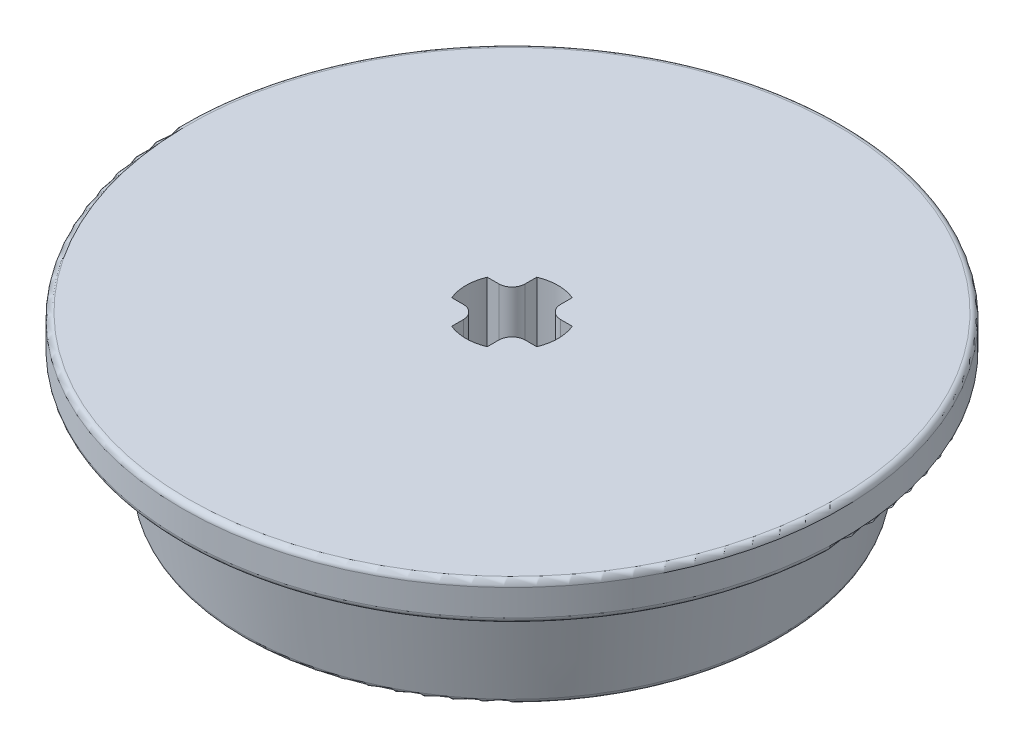
ISO-10303-21;
HEADER;
FILE_DESCRIPTION(('STEP AP214'),'2;1');
FILE_NAME('part.step','',(''),(''),'','','');
FILE_SCHEMA(('AUTOMOTIVE_DESIGN { 1 0 10303 214 1 1 1 1 }'));
ENDSEC;
DATA;
#1=APPLICATION_CONTEXT('core data for automotive mechanical design processes');
#2=APPLICATION_PROTOCOL_DEFINITION('international standard','automotive_design',2000,#1);
#3=PRODUCT_CONTEXT('',#1,'mechanical');
#4=PRODUCT('Part','Part','',(#3));
#5=PRODUCT_RELATED_PRODUCT_CATEGORY('part','',(#4));
#6=PRODUCT_DEFINITION_FORMATION('','',#4);
#7=PRODUCT_DEFINITION_CONTEXT('part definition',#1,'design');
#8=PRODUCT_DEFINITION('design','',#6,#7);
#9=PRODUCT_DEFINITION_SHAPE('','',#8);
#10=(LENGTH_UNIT() NAMED_UNIT(*) SI_UNIT(.MILLI.,.METRE.));
#11=(NAMED_UNIT(*) PLANE_ANGLE_UNIT() SI_UNIT($,.RADIAN.));
#12=(NAMED_UNIT(*) SI_UNIT($,.STERADIAN.) SOLID_ANGLE_UNIT());
#13=UNCERTAINTY_MEASURE_WITH_UNIT(LENGTH_MEASURE(1.E-05),#10,'distance_accuracy_value','');
#14=(GEOMETRIC_REPRESENTATION_CONTEXT(3) GLOBAL_UNCERTAINTY_ASSIGNED_CONTEXT((#13)) GLOBAL_UNIT_ASSIGNED_CONTEXT((#10,
#11,#12)) REPRESENTATION_CONTEXT('',''));
#15=CARTESIAN_POINT('',(0.,0.,0.));
#16=DIRECTION('',(0.,0.,1.));
#17=DIRECTION('',(1.,0.,0.));
#18=AXIS2_PLACEMENT_3D('',#15,#16,#17);
#19=CARTESIAN_POINT('',(0.,0.,0.));
#20=DIRECTION('',(0.,1.,0.));
#21=DIRECTION('',(0.,0.,1.));
#22=AXIS2_PLACEMENT_3D('',#19,#20,#21);
#23=PLANE('',#22);
#24=CARTESIAN_POINT('',(0.,0.,0.));
#25=DIRECTION('',(0.,1.,0.));
#26=DIRECTION('',(0.,0.,1.));
#27=AXIS2_PLACEMENT_3D('',#24,#25,#26);
#28=CIRCLE('',#27,17.1604709958205);
#29=CARTESIAN_POINT('',(0.,0.,17.1604709958205));
#30=VERTEX_POINT('',#29);
#31=EDGE_CURVE('E292',#30,#30,#28,.T.);
#32=ORIENTED_EDGE('',*,*,#31,.T.);
#33=EDGE_LOOP('',(#32));
#34=FACE_BOUND('',#33,.T.);
#35=DIRECTION('',(0.,0.,1.));
#36=VECTOR('',#35,1.);
#37=CARTESIAN_POINT('',(-0.940000000000001,0.,0.940000000000009));
#38=LINE('',#37,#36);
#39=CARTESIAN_POINT('',(-0.940000000000001,0.,1.64000000000001));
#40=VERTEX_POINT('',#39);
#41=CARTESIAN_POINT('',(-0.94,0.,2.25166604983954));
#42=VERTEX_POINT('',#41);
#43=EDGE_CURVE('E209',#40,#42,#38,.T.);
#44=ORIENTED_EDGE('',*,*,#43,.F.);
#45=CARTESIAN_POINT('',(-1.64,0.,1.64000000000001));
#46=DIRECTION('',(0.,1.,0.));
#47=DIRECTION('',(0.,0.,1.));
#48=AXIS2_PLACEMENT_3D('',#45,#46,#47);
#49=CIRCLE('',#48,0.7);
#50=CARTESIAN_POINT('',(-1.64,0.,0.940000000000009));
#51=VERTEX_POINT('',#50);
#52=EDGE_CURVE('E253',#40,#51,#49,.T.);
#53=ORIENTED_EDGE('',*,*,#52,.T.);
#54=DIRECTION('',(1.,0.,0.));
#55=VECTOR('',#54,1.);
#56=CARTESIAN_POINT('',(-2.25166604983954,0.,0.940000000000009));
#57=LINE('',#56,#55);
#58=CARTESIAN_POINT('',(-2.25166604983954,0.,0.940000000000008));
#59=VERTEX_POINT('',#58);
#60=EDGE_CURVE('E207',#59,#51,#57,.T.);
#61=ORIENTED_EDGE('',*,*,#60,.F.);
#62=CARTESIAN_POINT('',(0.,0.,0.));
#63=DIRECTION('',(0.,1.,0.));
#64=DIRECTION('',(0.,0.,1.));
#65=AXIS2_PLACEMENT_3D('',#62,#63,#64);
#66=CIRCLE('',#65,2.44);
#67=CARTESIAN_POINT('',(-2.25166604983954,0.,-0.940000000000009));
#68=VERTEX_POINT('',#67);
#69=EDGE_CURVE('E159',#68,#59,#66,.T.);
#70=ORIENTED_EDGE('',*,*,#69,.F.);
#71=DIRECTION('',(-1.,0.,0.));
#72=VECTOR('',#71,1.);
#73=CARTESIAN_POINT('',(-0.94,0.,-0.940000000000009));
#74=LINE('',#73,#72);
#75=CARTESIAN_POINT('',(-1.64,0.,-0.940000000000009));
#76=VERTEX_POINT('',#75);
#77=EDGE_CURVE('E204',#76,#68,#74,.T.);
#78=ORIENTED_EDGE('',*,*,#77,.F.);
#79=CARTESIAN_POINT('',(-1.64,0.,-1.64000000000001));
#80=DIRECTION('',(0.,1.,0.));
#81=DIRECTION('',(0.,0.,1.));
#82=AXIS2_PLACEMENT_3D('',#79,#80,#81);
#83=CIRCLE('',#82,0.7);
#84=CARTESIAN_POINT('',(-0.94,0.,-1.64000000000001));
#85=VERTEX_POINT('',#84);
#86=EDGE_CURVE('E247',#76,#85,#83,.T.);
#87=ORIENTED_EDGE('',*,*,#86,.T.);
#88=DIRECTION('',(0.,0.,1.));
#89=VECTOR('',#88,1.);
#90=CARTESIAN_POINT('',(-0.94,0.,-2.25166604983954));
#91=LINE('',#90,#89);
#92=CARTESIAN_POINT('',(-0.940000000000001,0.,-2.25166604983954));
#93=VERTEX_POINT('',#92);
#94=EDGE_CURVE('E201',#93,#85,#91,.T.);
#95=ORIENTED_EDGE('',*,*,#94,.F.);
#96=CARTESIAN_POINT('',(0.,0.,0.));
#97=DIRECTION('',(0.,1.,0.));
#98=DIRECTION('',(0.,0.,-1.));
#99=AXIS2_PLACEMENT_3D('',#96,#97,#98);
#100=CIRCLE('',#99,2.44);
#101=CARTESIAN_POINT('',(0.94,0.,-2.25166604983954));
#102=VERTEX_POINT('',#101);
#103=EDGE_CURVE('E226',#102,#93,#100,.T.);
#104=ORIENTED_EDGE('',*,*,#103,.F.);
#105=DIRECTION('',(0.,0.,-1.));
#106=VECTOR('',#105,1.);
#107=CARTESIAN_POINT('',(0.94,0.,-2.25166604983954));
#108=LINE('',#107,#106);
#109=CARTESIAN_POINT('',(0.94,0.,-1.64));
#110=VERTEX_POINT('',#109);
#111=EDGE_CURVE('E224',#110,#102,#108,.T.);
#112=ORIENTED_EDGE('',*,*,#111,.F.);
#113=CARTESIAN_POINT('',(1.64,0.,-1.64));
#114=DIRECTION('',(0.,1.,0.));
#115=DIRECTION('',(0.,0.,1.));
#116=AXIS2_PLACEMENT_3D('',#113,#114,#115);
#117=CIRCLE('',#116,0.7);
#118=CARTESIAN_POINT('',(1.64,0.,-0.940000000000003));
#119=VERTEX_POINT('',#118);
#120=EDGE_CURVE('E249',#110,#119,#117,.T.);
#121=ORIENTED_EDGE('',*,*,#120,.T.);
#122=DIRECTION('',(-1.,0.,0.));
#123=VECTOR('',#122,1.);
#124=CARTESIAN_POINT('',(0.94,0.,-0.940000000000003));
#125=LINE('',#124,#123);
#126=CARTESIAN_POINT('',(2.25166604983954,0.,-0.940000000000003));
#127=VERTEX_POINT('',#126);
#128=EDGE_CURVE('E222',#127,#119,#125,.T.);
#129=ORIENTED_EDGE('',*,*,#128,.F.);
#130=CARTESIAN_POINT('',(0.,0.,0.));
#131=DIRECTION('',(0.,1.,0.));
#132=DIRECTION('',(0.,0.,-1.));
#133=AXIS2_PLACEMENT_3D('',#130,#131,#132);
#134=CIRCLE('',#133,2.44);
#135=CARTESIAN_POINT('',(2.25166604983954,0.,0.940000000000003));
#136=VERTEX_POINT('',#135);
#137=EDGE_CURVE('E219',#136,#127,#134,.T.);
#138=ORIENTED_EDGE('',*,*,#137,.F.);
#139=DIRECTION('',(1.,0.,0.));
#140=VECTOR('',#139,1.);
#141=CARTESIAN_POINT('',(0.940000000000001,0.,0.940000000000003));
#142=LINE('',#141,#140);
#143=CARTESIAN_POINT('',(1.64,0.,0.940000000000003));
#144=VERTEX_POINT('',#143);
#145=EDGE_CURVE('E217',#144,#136,#142,.T.);
#146=ORIENTED_EDGE('',*,*,#145,.F.);
#147=CARTESIAN_POINT('',(1.64,0.,1.64));
#148=DIRECTION('',(0.,1.,0.));
#149=DIRECTION('',(0.,0.,1.));
#150=AXIS2_PLACEMENT_3D('',#147,#148,#149);
#151=CIRCLE('',#150,0.7);
#152=CARTESIAN_POINT('',(0.940000000000001,0.,1.64));
#153=VERTEX_POINT('',#152);
#154=EDGE_CURVE('E251',#144,#153,#151,.T.);
#155=ORIENTED_EDGE('',*,*,#154,.T.);
#156=DIRECTION('',(0.,0.,-1.));
#157=VECTOR('',#156,1.);
#158=CARTESIAN_POINT('',(0.940000000000001,0.,2.25166604983954));
#159=LINE('',#158,#157);
#160=CARTESIAN_POINT('',(0.94,0.,2.25166604983954));
#161=VERTEX_POINT('',#160);
#162=EDGE_CURVE('E214',#161,#153,#159,.T.);
#163=ORIENTED_EDGE('',*,*,#162,.F.);
#164=CARTESIAN_POINT('',(0.,0.,0.));
#165=DIRECTION('',(0.,1.,0.));
#166=DIRECTION('',(0.,0.,1.));
#167=AXIS2_PLACEMENT_3D('',#164,#165,#166);
#168=CIRCLE('',#167,2.44);
#169=EDGE_CURVE('E211',#42,#161,#168,.T.);
#170=ORIENTED_EDGE('',*,*,#169,.F.);
#171=EDGE_LOOP('',(#44,#53,#61,#70,#78,#87,#95,#104,#112,#121,#129,#138,#146,#155,#163,#170));
#172=FACE_BOUND('',#171,.T.);
#173=ADVANCED_FACE('F36',(#34,#172),#23,.T.);
#174=CARTESIAN_POINT('',(0.,0.,0.));
#175=DIRECTION('',(0.,-1.,0.));
#176=DIRECTION('',(0.,0.,-1.));
#177=AXIS2_PLACEMENT_3D('',#174,#175,#176);
#178=CYLINDRICAL_SURFACE('',#177,17.4604709958205);
#179=CARTESIAN_POINT('',(0.,-0.3,0.));
#180=DIRECTION('',(0.,1.,0.));
#181=DIRECTION('',(0.,0.,1.));
#182=AXIS2_PLACEMENT_3D('',#179,#180,#181);
#183=CIRCLE('',#182,17.4604709958205);
#184=CARTESIAN_POINT('',(0.,-0.3,17.4604709958205));
#185=VERTEX_POINT('',#184);
#186=EDGE_CURVE('E289',#185,#185,#183,.F.);
#187=ORIENTED_EDGE('',*,*,#186,.T.);
#188=EDGE_LOOP('',(#187));
#189=FACE_BOUND('',#188,.T.);
#190=CARTESIAN_POINT('',(0.,-1.7,0.));
#191=DIRECTION('',(0.,-1.,0.));
#192=DIRECTION('',(0.,0.,-1.));
#193=AXIS2_PLACEMENT_3D('',#190,#191,#192);
#194=CIRCLE('',#193,17.4604709958205);
#195=CARTESIAN_POINT('',(0.,-1.7,-17.4604709958205));
#196=VERTEX_POINT('',#195);
#197=EDGE_CURVE('E286',#196,#196,#194,.F.);
#198=ORIENTED_EDGE('',*,*,#197,.T.);
#199=EDGE_LOOP('',(#198));
#200=FACE_BOUND('',#199,.T.);
#201=ADVANCED_FACE('F309',(#189,#200),#178,.T.);
#202=CARTESIAN_POINT('',(17.4604709958205,-2.,0.));
#203=DIRECTION('',(0.,-1.,0.));
#204=DIRECTION('',(0.,0.,-1.));
#205=AXIS2_PLACEMENT_3D('',#202,#203,#204);
#206=PLANE('',#205);
#207=CARTESIAN_POINT('',(0.,-2.,0.));
#208=DIRECTION('',(0.,-1.,0.));
#209=DIRECTION('',(0.,0.,-1.));
#210=AXIS2_PLACEMENT_3D('',#207,#208,#209);
#211=CIRCLE('',#210,15.2607860213451);
#212=CARTESIAN_POINT('',(0.,-2.,-15.2607860213451));
#213=VERTEX_POINT('',#212);
#214=EDGE_CURVE('E11',#213,#213,#211,.F.);
#215=ORIENTED_EDGE('',*,*,#214,.T.);
#216=EDGE_LOOP('',(#215));
#217=FACE_BOUND('',#216,.T.);
#218=CARTESIAN_POINT('',(0.,-2.,0.));
#219=DIRECTION('',(0.,-1.,0.));
#220=DIRECTION('',(0.,0.,-1.));
#221=AXIS2_PLACEMENT_3D('',#218,#219,#220);
#222=CIRCLE('',#221,17.1604709958205);
#223=CARTESIAN_POINT('',(0.,-2.,-17.1604709958205));
#224=VERTEX_POINT('',#223);
#225=EDGE_CURVE('E44',#224,#224,#222,.T.);
#226=ORIENTED_EDGE('',*,*,#225,.T.);
#227=EDGE_LOOP('',(#226));
#228=FACE_BOUND('',#227,.T.);
#229=ADVANCED_FACE('F297',(#217,#228),#206,.T.);
#230=CARTESIAN_POINT('',(0.,-8.,0.));
#231=DIRECTION('',(0.,1.,0.));
#232=DIRECTION('',(0.,0.,1.));
#233=AXIS2_PLACEMENT_3D('',#230,#231,#232);
#234=CONICAL_SURFACE('',#233,14.1567549917908,0.139626340158703);
#235=CARTESIAN_POINT('',(0.,-7.74175193028776,0.));
#236=DIRECTION('',(0.,-1.,0.));
#237=DIRECTION('',(0.,0.,-1.));
#238=AXIS2_PLACEMENT_3D('',#235,#236,#237);
#239=CIRCLE('',#238,14.1930493910682);
#240=CARTESIAN_POINT('',(0.,-7.74175193028776,-14.1930493910682));
#241=VERTEX_POINT('',#240);
#242=EDGE_CURVE('E283',#241,#241,#239,.F.);
#243=ORIENTED_EDGE('',*,*,#242,.T.);
#244=EDGE_LOOP('',(#243));
#245=FACE_BOUND('',#244,.T.);
#246=CARTESIAN_POINT('',(0.,-2.25824806971223,0.));
#247=DIRECTION('',(0.,1.,0.));
#248=DIRECTION('',(0.,0.,1.));
#249=AXIS2_PLACEMENT_3D('',#246,#247,#248);
#250=CIRCLE('',#249,14.9637056007226);
#251=CARTESIAN_POINT('',(0.,-2.25824806971223,14.9637056007226));
#252=VERTEX_POINT('',#251);
#253=EDGE_CURVE('E280',#252,#252,#250,.F.);
#254=ORIENTED_EDGE('',*,*,#253,.T.);
#255=EDGE_LOOP('',(#254));
#256=FACE_BOUND('',#255,.T.);
#257=ADVANCED_FACE('F519',(#245,#256),#234,.T.);
#258=CARTESIAN_POINT('',(14.1567549917908,-8.,0.));
#259=DIRECTION('',(0.,-1.,0.));
#260=DIRECTION('',(0.,0.,-1.));
#261=AXIS2_PLACEMENT_3D('',#258,#259,#260);
#262=PLANE('',#261);
#263=CARTESIAN_POINT('',(0.,-8.,0.));
#264=DIRECTION('',(0.,-1.,0.));
#265=DIRECTION('',(0.,0.,-1.));
#266=AXIS2_PLACEMENT_3D('',#263,#264,#265);
#267=CIRCLE('',#266,13.8959689704457);
#268=CARTESIAN_POINT('',(0.,-8.,-13.8959689704457));
#269=VERTEX_POINT('',#268);
#270=EDGE_CURVE('E277',#269,#269,#267,.T.);
#271=ORIENTED_EDGE('',*,*,#270,.T.);
#272=EDGE_LOOP('',(#271));
#273=FACE_BOUND('',#272,.T.);
#274=DIRECTION('',(1.,0.,0.));
#275=VECTOR('',#274,1.);
#276=CARTESIAN_POINT('',(-2.25166604983954,-8.,0.940000000000009));
#277=LINE('',#276,#275);
#278=CARTESIAN_POINT('',(-2.25166604983954,-8.,0.940000000000008));
#279=VERTEX_POINT('',#278);
#280=CARTESIAN_POINT('',(-1.64,-8.,0.940000000000009));
#281=VERTEX_POINT('',#280);
#282=EDGE_CURVE('E167',#279,#281,#277,.T.);
#283=ORIENTED_EDGE('',*,*,#282,.T.);
#284=CARTESIAN_POINT('',(-1.64,-8.,1.64000000000001));
#285=DIRECTION('',(0.,-1.,0.));
#286=DIRECTION('',(0.,0.,-1.));
#287=AXIS2_PLACEMENT_3D('',#284,#285,#286);
#288=CIRCLE('',#287,0.7);
#289=CARTESIAN_POINT('',(-0.940000000000001,-8.,1.64000000000001));
#290=VERTEX_POINT('',#289);
#291=EDGE_CURVE('E261',#281,#290,#288,.T.);
#292=ORIENTED_EDGE('',*,*,#291,.T.);
#293=DIRECTION('',(0.,0.,1.));
#294=VECTOR('',#293,1.);
#295=CARTESIAN_POINT('',(-0.940000000000001,-8.,0.940000000000009));
#296=LINE('',#295,#294);
#297=CARTESIAN_POINT('',(-0.94,-8.,2.25166604983954));
#298=VERTEX_POINT('',#297);
#299=EDGE_CURVE('E172',#290,#298,#296,.T.);
#300=ORIENTED_EDGE('',*,*,#299,.T.);
#301=CARTESIAN_POINT('',(0.,-8.,0.));
#302=DIRECTION('',(0.,1.,0.));
#303=DIRECTION('',(0.,0.,1.));
#304=AXIS2_PLACEMENT_3D('',#301,#302,#303);
#305=CIRCLE('',#304,2.44);
#306=CARTESIAN_POINT('',(0.94,-8.,2.25166604983954));
#307=VERTEX_POINT('',#306);
#308=EDGE_CURVE('E183',#298,#307,#305,.T.);
#309=ORIENTED_EDGE('',*,*,#308,.T.);
#310=DIRECTION('',(0.,0.,-1.));
#311=VECTOR('',#310,1.);
#312=CARTESIAN_POINT('',(0.940000000000001,-8.,2.25166604983954));
#313=LINE('',#312,#311);
#314=CARTESIAN_POINT('',(0.940000000000001,-8.,1.64));
#315=VERTEX_POINT('',#314);
#316=EDGE_CURVE('E186',#307,#315,#313,.T.);
#317=ORIENTED_EDGE('',*,*,#316,.T.);
#318=CARTESIAN_POINT('',(1.64,-8.,1.64));
#319=DIRECTION('',(0.,-1.,0.));
#320=DIRECTION('',(0.,0.,-1.));
#321=AXIS2_PLACEMENT_3D('',#318,#319,#320);
#322=CIRCLE('',#321,0.7);
#323=CARTESIAN_POINT('',(1.64,-8.,0.940000000000003));
#324=VERTEX_POINT('',#323);
#325=EDGE_CURVE('E259',#315,#324,#322,.T.);
#326=ORIENTED_EDGE('',*,*,#325,.T.);
#327=DIRECTION('',(1.,0.,0.));
#328=VECTOR('',#327,1.);
#329=CARTESIAN_POINT('',(0.940000000000001,-8.,0.940000000000003));
#330=LINE('',#329,#328);
#331=CARTESIAN_POINT('',(2.25166604983954,-8.,0.940000000000003));
#332=VERTEX_POINT('',#331);
#333=EDGE_CURVE('E189',#324,#332,#330,.T.);
#334=ORIENTED_EDGE('',*,*,#333,.T.);
#335=CARTESIAN_POINT('',(0.,-8.,0.));
#336=DIRECTION('',(0.,1.,0.));
#337=DIRECTION('',(0.,0.,-1.));
#338=AXIS2_PLACEMENT_3D('',#335,#336,#337);
#339=CIRCLE('',#338,2.44);
#340=CARTESIAN_POINT('',(2.25166604983954,-8.,-0.940000000000003));
#341=VERTEX_POINT('',#340);
#342=EDGE_CURVE('E191',#332,#341,#339,.T.);
#343=ORIENTED_EDGE('',*,*,#342,.T.);
#344=DIRECTION('',(-1.,0.,0.));
#345=VECTOR('',#344,1.);
#346=CARTESIAN_POINT('',(0.94,-8.,-0.940000000000003));
#347=LINE('',#346,#345);
#348=CARTESIAN_POINT('',(1.64,-8.,-0.940000000000003));
#349=VERTEX_POINT('',#348);
#350=EDGE_CURVE('E194',#341,#349,#347,.T.);
#351=ORIENTED_EDGE('',*,*,#350,.T.);
#352=CARTESIAN_POINT('',(1.64,-8.,-1.64));
#353=DIRECTION('',(0.,-1.,0.));
#354=DIRECTION('',(0.,0.,-1.));
#355=AXIS2_PLACEMENT_3D('',#352,#353,#354);
#356=CIRCLE('',#355,0.7);
#357=CARTESIAN_POINT('',(0.94,-8.,-1.64));
#358=VERTEX_POINT('',#357);
#359=EDGE_CURVE('E51',#349,#358,#356,.T.);
#360=ORIENTED_EDGE('',*,*,#359,.T.);
#361=DIRECTION('',(0.,0.,-1.));
#362=VECTOR('',#361,1.);
#363=CARTESIAN_POINT('',(0.94,-8.,-2.25166604983954));
#364=LINE('',#363,#362);
#365=CARTESIAN_POINT('',(0.94,-8.,-2.25166604983954));
#366=VERTEX_POINT('',#365);
#367=EDGE_CURVE('E196',#358,#366,#364,.T.);
#368=ORIENTED_EDGE('',*,*,#367,.T.);
#369=CARTESIAN_POINT('',(0.,-8.,0.));
#370=DIRECTION('',(0.,1.,0.));
#371=DIRECTION('',(0.,0.,-1.));
#372=AXIS2_PLACEMENT_3D('',#369,#370,#371);
#373=CIRCLE('',#372,2.44);
#374=CARTESIAN_POINT('',(-0.940000000000001,-8.,-2.25166604983954));
#375=VERTEX_POINT('',#374);
#376=EDGE_CURVE('E198',#366,#375,#373,.T.);
#377=ORIENTED_EDGE('',*,*,#376,.T.);
#378=DIRECTION('',(0.,0.,1.));
#379=VECTOR('',#378,1.);
#380=CARTESIAN_POINT('',(-0.94,-8.,-2.25166604983954));
#381=LINE('',#380,#379);
#382=CARTESIAN_POINT('',(-0.94,-8.,-1.64000000000001));
#383=VERTEX_POINT('',#382);
#384=EDGE_CURVE('E178',#375,#383,#381,.T.);
#385=ORIENTED_EDGE('',*,*,#384,.T.);
#386=CARTESIAN_POINT('',(-1.64,-8.,-1.64000000000001));
#387=DIRECTION('',(0.,-1.,0.));
#388=DIRECTION('',(0.,0.,-1.));
#389=AXIS2_PLACEMENT_3D('',#386,#387,#388);
#390=CIRCLE('',#389,0.7);
#391=CARTESIAN_POINT('',(-1.64,-8.,-0.940000000000009));
#392=VERTEX_POINT('',#391);
#393=EDGE_CURVE('E256',#383,#392,#390,.T.);
#394=ORIENTED_EDGE('',*,*,#393,.T.);
#395=DIRECTION('',(-1.,0.,0.));
#396=VECTOR('',#395,1.);
#397=CARTESIAN_POINT('',(-0.94,-8.,-0.940000000000009));
#398=LINE('',#397,#396);
#399=CARTESIAN_POINT('',(-2.25166604983954,-8.,-0.940000000000009));
#400=VERTEX_POINT('',#399);
#401=EDGE_CURVE('E176',#392,#400,#398,.T.);
#402=ORIENTED_EDGE('',*,*,#401,.T.);
#403=CARTESIAN_POINT('',(0.,-8.,0.));
#404=DIRECTION('',(0.,1.,0.));
#405=DIRECTION('',(0.,0.,1.));
#406=AXIS2_PLACEMENT_3D('',#403,#404,#405);
#407=CIRCLE('',#406,2.44);
#408=EDGE_CURVE('E156',#400,#279,#407,.T.);
#409=ORIENTED_EDGE('',*,*,#408,.T.);
#410=EDGE_LOOP('',(#283,#292,#300,#309,#317,#326,#334,#343,#351,#360,#368,#377,#385,#394,#402,#409));
#411=FACE_BOUND('',#410,.T.);
#412=ADVANCED_FACE('F174',(#273,#411),#262,.T.);
#413=CARTESIAN_POINT('',(-0.94,-8.,-2.25166604983954));
#414=DIRECTION('',(-1.,0.,0.));
#415=DIRECTION('',(0.,0.,1.));
#416=AXIS2_PLACEMENT_3D('',#413,#414,#415);
#417=PLANE('',#416);
#418=ORIENTED_EDGE('',*,*,#94,.T.);
#419=DIRECTION('',(0.,1.,0.));
#420=VECTOR('',#419,1.);
#421=CARTESIAN_POINT('',(-0.94,-8.,-1.64000000000001));
#422=LINE('',#421,#420);
#423=EDGE_CURVE('E275',#85,#383,#422,.F.);
#424=ORIENTED_EDGE('',*,*,#423,.T.);
#425=ORIENTED_EDGE('',*,*,#384,.F.);
#426=DIRECTION('',(0.,1.,0.));
#427=VECTOR('',#426,1.);
#428=CARTESIAN_POINT('',(-0.940000000000001,-8.,-2.25166604983954));
#429=LINE('',#428,#427);
#430=EDGE_CURVE('E229',#375,#93,#429,.T.);
#431=ORIENTED_EDGE('',*,*,#430,.T.);
#432=EDGE_LOOP('',(#418,#424,#425,#431));
#433=FACE_BOUND('',#432,.T.);
#434=ADVANCED_FACE('F500',(#433),#417,.F.);
#435=CARTESIAN_POINT('',(0.,-8.,0.));
#436=DIRECTION('',(0.,1.,0.));
#437=DIRECTION('',(0.,0.,1.));
#438=AXIS2_PLACEMENT_3D('',#435,#436,#437);
#439=CYLINDRICAL_SURFACE('',#438,2.44);
#440=ORIENTED_EDGE('',*,*,#103,.T.);
#441=ORIENTED_EDGE('',*,*,#430,.F.);
#442=ORIENTED_EDGE('',*,*,#376,.F.);
#443=DIRECTION('',(0.,1.,0.));
#444=VECTOR('',#443,1.);
#445=CARTESIAN_POINT('',(0.94,-8.,-2.25166604983954));
#446=LINE('',#445,#444);
#447=EDGE_CURVE('E232',#366,#102,#446,.T.);
#448=ORIENTED_EDGE('',*,*,#447,.T.);
#449=EDGE_LOOP('',(#440,#441,#442,#448));
#450=FACE_BOUND('',#449,.T.);
#451=ADVANCED_FACE('F490',(#450),#439,.F.);
#452=CARTESIAN_POINT('',(0.94,-8.,-2.25166604983954));
#453=DIRECTION('',(1.,0.,0.));
#454=DIRECTION('',(0.,0.,-1.));
#455=AXIS2_PLACEMENT_3D('',#452,#453,#454);
#456=PLANE('',#455);
#457=ORIENTED_EDGE('',*,*,#367,.F.);
#458=DIRECTION('',(0.,1.,0.));
#459=VECTOR('',#458,1.);
#460=CARTESIAN_POINT('',(0.94,-8.,-1.64));
#461=LINE('',#460,#459);
#462=EDGE_CURVE('E268',#358,#110,#461,.T.);
#463=ORIENTED_EDGE('',*,*,#462,.T.);
#464=ORIENTED_EDGE('',*,*,#111,.T.);
#465=ORIENTED_EDGE('',*,*,#447,.F.);
#466=EDGE_LOOP('',(#457,#463,#464,#465));
#467=FACE_BOUND('',#466,.T.);
#468=ADVANCED_FACE('F481',(#467),#456,.F.);
#469=CARTESIAN_POINT('',(0.94,-8.,-0.940000000000003));
#470=DIRECTION('',(0.,0.,-1.));
#471=DIRECTION('',(-1.,0.,0.));
#472=AXIS2_PLACEMENT_3D('',#469,#470,#471);
#473=PLANE('',#472);
#474=ORIENTED_EDGE('',*,*,#128,.T.);
#475=DIRECTION('',(0.,1.,0.));
#476=VECTOR('',#475,1.);
#477=CARTESIAN_POINT('',(1.64,-8.,-0.940000000000003));
#478=LINE('',#477,#476);
#479=EDGE_CURVE('E59',#119,#349,#478,.F.);
#480=ORIENTED_EDGE('',*,*,#479,.T.);
#481=ORIENTED_EDGE('',*,*,#350,.F.);
#482=DIRECTION('',(0.,1.,0.));
#483=VECTOR('',#482,1.);
#484=CARTESIAN_POINT('',(2.25166604983954,-8.,-0.940000000000003));
#485=LINE('',#484,#483);
#486=EDGE_CURVE('E235',#341,#127,#485,.T.);
#487=ORIENTED_EDGE('',*,*,#486,.T.);
#488=EDGE_LOOP('',(#474,#480,#481,#487));
#489=FACE_BOUND('',#488,.T.);
#490=ADVANCED_FACE('F471',(#489),#473,.F.);
#491=CARTESIAN_POINT('',(0.,-8.,0.));
#492=DIRECTION('',(0.,1.,0.));
#493=DIRECTION('',(0.,0.,1.));
#494=AXIS2_PLACEMENT_3D('',#491,#492,#493);
#495=CYLINDRICAL_SURFACE('',#494,2.44);
#496=ORIENTED_EDGE('',*,*,#137,.T.);
#497=ORIENTED_EDGE('',*,*,#486,.F.);
#498=ORIENTED_EDGE('',*,*,#342,.F.);
#499=DIRECTION('',(0.,1.,0.));
#500=VECTOR('',#499,1.);
#501=CARTESIAN_POINT('',(2.25166604983954,-8.,0.940000000000003));
#502=LINE('',#501,#500);
#503=EDGE_CURVE('E237',#332,#136,#502,.T.);
#504=ORIENTED_EDGE('',*,*,#503,.T.);
#505=EDGE_LOOP('',(#496,#497,#498,#504));
#506=FACE_BOUND('',#505,.T.);
#507=ADVANCED_FACE('F461',(#506),#495,.F.);
#508=CARTESIAN_POINT('',(0.940000000000001,-8.,0.940000000000003));
#509=DIRECTION('',(0.,0.,1.));
#510=DIRECTION('',(1.,0.,0.));
#511=AXIS2_PLACEMENT_3D('',#508,#509,#510);
#512=PLANE('',#511);
#513=ORIENTED_EDGE('',*,*,#333,.F.);
#514=DIRECTION('',(0.,1.,0.));
#515=VECTOR('',#514,1.);
#516=CARTESIAN_POINT('',(1.64,-8.,0.940000000000003));
#517=LINE('',#516,#515);
#518=EDGE_CURVE('E263',#324,#144,#517,.T.);
#519=ORIENTED_EDGE('',*,*,#518,.T.);
#520=ORIENTED_EDGE('',*,*,#145,.T.);
#521=ORIENTED_EDGE('',*,*,#503,.F.);
#522=EDGE_LOOP('',(#513,#519,#520,#521));
#523=FACE_BOUND('',#522,.T.);
#524=ADVANCED_FACE('F451',(#523),#512,.F.);
#525=CARTESIAN_POINT('',(0.940000000000001,-8.,2.25166604983954));
#526=DIRECTION('',(1.,0.,0.));
#527=DIRECTION('',(0.,0.,-1.));
#528=AXIS2_PLACEMENT_3D('',#525,#526,#527);
#529=PLANE('',#528);
#530=ORIENTED_EDGE('',*,*,#162,.T.);
#531=DIRECTION('',(0.,1.,0.));
#532=VECTOR('',#531,1.);
#533=CARTESIAN_POINT('',(0.940000000000001,-8.,1.64));
#534=LINE('',#533,#532);
#535=EDGE_CURVE('E266',#153,#315,#534,.F.);
#536=ORIENTED_EDGE('',*,*,#535,.T.);
#537=ORIENTED_EDGE('',*,*,#316,.F.);
#538=DIRECTION('',(0.,1.,0.));
#539=VECTOR('',#538,1.);
#540=CARTESIAN_POINT('',(0.94,-8.,2.25166604983954));
#541=LINE('',#540,#539);
#542=EDGE_CURVE('E240',#307,#161,#541,.T.);
#543=ORIENTED_EDGE('',*,*,#542,.T.);
#544=EDGE_LOOP('',(#530,#536,#537,#543));
#545=FACE_BOUND('',#544,.T.);
#546=ADVANCED_FACE('F441',(#545),#529,.F.);
#547=CARTESIAN_POINT('',(0.,-8.,0.));
#548=DIRECTION('',(0.,1.,0.));
#549=DIRECTION('',(0.,0.,1.));
#550=AXIS2_PLACEMENT_3D('',#547,#548,#549);
#551=CYLINDRICAL_SURFACE('',#550,2.44);
#552=ORIENTED_EDGE('',*,*,#169,.T.);
#553=ORIENTED_EDGE('',*,*,#542,.F.);
#554=ORIENTED_EDGE('',*,*,#308,.F.);
#555=DIRECTION('',(0.,1.,0.));
#556=VECTOR('',#555,1.);
#557=CARTESIAN_POINT('',(-0.94,-8.,2.25166604983954));
#558=LINE('',#557,#556);
#559=EDGE_CURVE('E163',#298,#42,#558,.T.);
#560=ORIENTED_EDGE('',*,*,#559,.T.);
#561=EDGE_LOOP('',(#552,#553,#554,#560));
#562=FACE_BOUND('',#561,.T.);
#563=ADVANCED_FACE('F431',(#562),#551,.F.);
#564=CARTESIAN_POINT('',(-0.940000000000001,-8.,0.940000000000009));
#565=DIRECTION('',(-1.,0.,0.));
#566=DIRECTION('',(0.,0.,1.));
#567=AXIS2_PLACEMENT_3D('',#564,#565,#566);
#568=PLANE('',#567);
#569=ORIENTED_EDGE('',*,*,#299,.F.);
#570=DIRECTION('',(0.,1.,0.));
#571=VECTOR('',#570,1.);
#572=CARTESIAN_POINT('',(-0.940000000000001,-8.,1.64000000000001));
#573=LINE('',#572,#571);
#574=EDGE_CURVE('E231',#290,#40,#573,.T.);
#575=ORIENTED_EDGE('',*,*,#574,.T.);
#576=ORIENTED_EDGE('',*,*,#43,.T.);
#577=ORIENTED_EDGE('',*,*,#559,.F.);
#578=EDGE_LOOP('',(#569,#575,#576,#577));
#579=FACE_BOUND('',#578,.T.);
#580=ADVANCED_FACE('F422',(#579),#568,.F.);
#581=CARTESIAN_POINT('',(-2.25166604983954,-8.,0.940000000000009));
#582=DIRECTION('',(0.,0.,1.));
#583=DIRECTION('',(1.,0.,0.));
#584=AXIS2_PLACEMENT_3D('',#581,#582,#583);
#585=PLANE('',#584);
#586=ORIENTED_EDGE('',*,*,#60,.T.);
#587=DIRECTION('',(0.,1.,0.));
#588=VECTOR('',#587,1.);
#589=CARTESIAN_POINT('',(-1.64,-8.,0.940000000000009));
#590=LINE('',#589,#588);
#591=EDGE_CURVE('E170',#51,#281,#590,.F.);
#592=ORIENTED_EDGE('',*,*,#591,.T.);
#593=ORIENTED_EDGE('',*,*,#282,.F.);
#594=DIRECTION('',(0.,1.,0.));
#595=VECTOR('',#594,1.);
#596=CARTESIAN_POINT('',(-2.25166604983954,-8.,0.940000000000008));
#597=LINE('',#596,#595);
#598=EDGE_CURVE('E151',#279,#59,#597,.T.);
#599=ORIENTED_EDGE('',*,*,#598,.T.);
#600=EDGE_LOOP('',(#586,#592,#593,#599));
#601=FACE_BOUND('',#600,.T.);
#602=ADVANCED_FACE('F168',(#601),#585,.F.);
#603=CARTESIAN_POINT('',(0.,-8.,0.));
#604=DIRECTION('',(0.,1.,0.));
#605=DIRECTION('',(0.,0.,1.));
#606=AXIS2_PLACEMENT_3D('',#603,#604,#605);
#607=CYLINDRICAL_SURFACE('',#606,2.44);
#608=ORIENTED_EDGE('',*,*,#69,.T.);
#609=ORIENTED_EDGE('',*,*,#598,.F.);
#610=ORIENTED_EDGE('',*,*,#408,.F.);
#611=DIRECTION('',(0.,1.,0.));
#612=VECTOR('',#611,1.);
#613=CARTESIAN_POINT('',(-2.25166604983954,-8.,-0.940000000000009));
#614=LINE('',#613,#612);
#615=EDGE_CURVE('E164',#400,#68,#614,.T.);
#616=ORIENTED_EDGE('',*,*,#615,.T.);
#617=EDGE_LOOP('',(#608,#609,#610,#616));
#618=FACE_BOUND('',#617,.T.);
#619=ADVANCED_FACE('F153',(#618),#607,.F.);
#620=CARTESIAN_POINT('',(-0.94,-8.,-0.940000000000009));
#621=DIRECTION('',(0.,0.,-1.));
#622=DIRECTION('',(-1.,0.,0.));
#623=AXIS2_PLACEMENT_3D('',#620,#621,#622);
#624=PLANE('',#623);
#625=ORIENTED_EDGE('',*,*,#401,.F.);
#626=DIRECTION('',(0.,1.,0.));
#627=VECTOR('',#626,1.);
#628=CARTESIAN_POINT('',(-1.64,-8.,-0.940000000000009));
#629=LINE('',#628,#627);
#630=EDGE_CURVE('E272',#392,#76,#629,.T.);
#631=ORIENTED_EDGE('',*,*,#630,.T.);
#632=ORIENTED_EDGE('',*,*,#77,.T.);
#633=ORIENTED_EDGE('',*,*,#615,.F.);
#634=EDGE_LOOP('',(#625,#631,#632,#633));
#635=FACE_BOUND('',#634,.T.);
#636=ADVANCED_FACE('F324',(#635),#624,.F.);
#637=CARTESIAN_POINT('',(-1.64,-8.,1.64000000000001));
#638=DIRECTION('',(0.,1.,0.));
#639=DIRECTION('',(0.,0.,1.));
#640=AXIS2_PLACEMENT_3D('',#637,#638,#639);
#641=CYLINDRICAL_SURFACE('',#640,0.7);
#642=ORIENTED_EDGE('',*,*,#291,.F.);
#643=ORIENTED_EDGE('',*,*,#591,.F.);
#644=ORIENTED_EDGE('',*,*,#52,.F.);
#645=ORIENTED_EDGE('',*,*,#574,.F.);
#646=EDGE_LOOP('',(#642,#643,#644,#645));
#647=FACE_BOUND('',#646,.T.);
#648=ADVANCED_FACE('F320',(#647),#641,.T.);
#649=CARTESIAN_POINT('',(1.64,-8.,1.64));
#650=DIRECTION('',(0.,1.,0.));
#651=DIRECTION('',(0.,0.,1.));
#652=AXIS2_PLACEMENT_3D('',#649,#650,#651);
#653=CYLINDRICAL_SURFACE('',#652,0.7);
#654=ORIENTED_EDGE('',*,*,#325,.F.);
#655=ORIENTED_EDGE('',*,*,#535,.F.);
#656=ORIENTED_EDGE('',*,*,#154,.F.);
#657=ORIENTED_EDGE('',*,*,#518,.F.);
#658=EDGE_LOOP('',(#654,#655,#656,#657));
#659=FACE_BOUND('',#658,.T.);
#660=ADVANCED_FACE('F323',(#659),#653,.T.);
#661=CARTESIAN_POINT('',(1.64,-8.,-1.64));
#662=DIRECTION('',(0.,1.,0.));
#663=DIRECTION('',(0.,0.,1.));
#664=AXIS2_PLACEMENT_3D('',#661,#662,#663);
#665=CYLINDRICAL_SURFACE('',#664,0.7);
#666=ORIENTED_EDGE('',*,*,#359,.F.);
#667=ORIENTED_EDGE('',*,*,#479,.F.);
#668=ORIENTED_EDGE('',*,*,#120,.F.);
#669=ORIENTED_EDGE('',*,*,#462,.F.);
#670=EDGE_LOOP('',(#666,#667,#668,#669));
#671=FACE_BOUND('',#670,.T.);
#672=ADVANCED_FACE('F328',(#671),#665,.T.);
#673=CARTESIAN_POINT('',(-1.64,-8.,-1.64000000000001));
#674=DIRECTION('',(0.,1.,0.));
#675=DIRECTION('',(0.,0.,1.));
#676=AXIS2_PLACEMENT_3D('',#673,#674,#675);
#677=CYLINDRICAL_SURFACE('',#676,0.7);
#678=ORIENTED_EDGE('',*,*,#393,.F.);
#679=ORIENTED_EDGE('',*,*,#423,.F.);
#680=ORIENTED_EDGE('',*,*,#86,.F.);
#681=ORIENTED_EDGE('',*,*,#630,.F.);
#682=EDGE_LOOP('',(#678,#679,#680,#681));
#683=FACE_BOUND('',#682,.T.);
#684=ADVANCED_FACE('F332',(#683),#677,.T.);
#685=CARTESIAN_POINT('',(0.,-7.7,0.));
#686=DIRECTION('',(0.,-1.,0.));
#687=DIRECTION('',(0.,0.,-1.));
#688=AXIS2_PLACEMENT_3D('',#685,#686,#687);
#689=TOROIDAL_SURFACE('',#688,13.8959689704457,0.3);
#690=ORIENTED_EDGE('',*,*,#242,.F.);
#691=EDGE_LOOP('',(#690));
#692=FACE_BOUND('',#691,.T.);
#693=ORIENTED_EDGE('',*,*,#270,.F.);
#694=EDGE_LOOP('',(#693));
#695=FACE_BOUND('',#694,.T.);
#696=ADVANCED_FACE('F336',(#692,#695),#689,.T.);
#697=CARTESIAN_POINT('',(0.,-0.3,0.));
#698=DIRECTION('',(0.,1.,0.));
#699=DIRECTION('',(0.,0.,1.));
#700=AXIS2_PLACEMENT_3D('',#697,#698,#699);
#701=TOROIDAL_SURFACE('',#700,17.1604709958205,0.3);
#702=ORIENTED_EDGE('',*,*,#31,.F.);
#703=EDGE_LOOP('',(#702));
#704=FACE_BOUND('',#703,.T.);
#705=ORIENTED_EDGE('',*,*,#186,.F.);
#706=EDGE_LOOP('',(#705));
#707=FACE_BOUND('',#706,.T.);
#708=ADVANCED_FACE('F305',(#704,#707),#701,.T.);
#709=CARTESIAN_POINT('',(0.,-2.3,0.));
#710=DIRECTION('',(0.,-1.,0.));
#711=DIRECTION('',(0.,0.,-1.));
#712=AXIS2_PLACEMENT_3D('',#709,#710,#711);
#713=TOROIDAL_SURFACE('',#712,15.2607860213451,0.3);
#714=ORIENTED_EDGE('',*,*,#214,.F.);
#715=EDGE_LOOP('',(#714));
#716=FACE_BOUND('',#715,.T.);
#717=ORIENTED_EDGE('',*,*,#253,.F.);
#718=EDGE_LOOP('',(#717));
#719=FACE_BOUND('',#718,.T.);
#720=ADVANCED_FACE('F300',(#716,#719),#713,.F.);
#721=CARTESIAN_POINT('',(0.,-1.7,0.));
#722=DIRECTION('',(0.,-1.,0.));
#723=DIRECTION('',(0.,0.,-1.));
#724=AXIS2_PLACEMENT_3D('',#721,#722,#723);
#725=TOROIDAL_SURFACE('',#724,17.1604709958205,0.3);
#726=ORIENTED_EDGE('',*,*,#197,.F.);
#727=EDGE_LOOP('',(#726));
#728=FACE_BOUND('',#727,.T.);
#729=ORIENTED_EDGE('',*,*,#225,.F.);
#730=EDGE_LOOP('',(#729));
#731=FACE_BOUND('',#730,.T.);
#732=ADVANCED_FACE('F38',(#728,#731),#725,.T.);
#733=CLOSED_SHELL('',(#173,#201,#229,#257,#412,#434,#451,#468,#490,#507,#524,#546,#563,#580,
#602,#619,#636,#648,#660,#672,#684,#696,#708,#720,#732));
#734=MANIFOLD_SOLID_BREP('B2',#733);
#735=ADVANCED_BREP_SHAPE_REPRESENTATION('',(#18,#734),#14);
#736=SHAPE_DEFINITION_REPRESENTATION(#9,#735);
ENDSEC;
END-ISO-10303-21;
